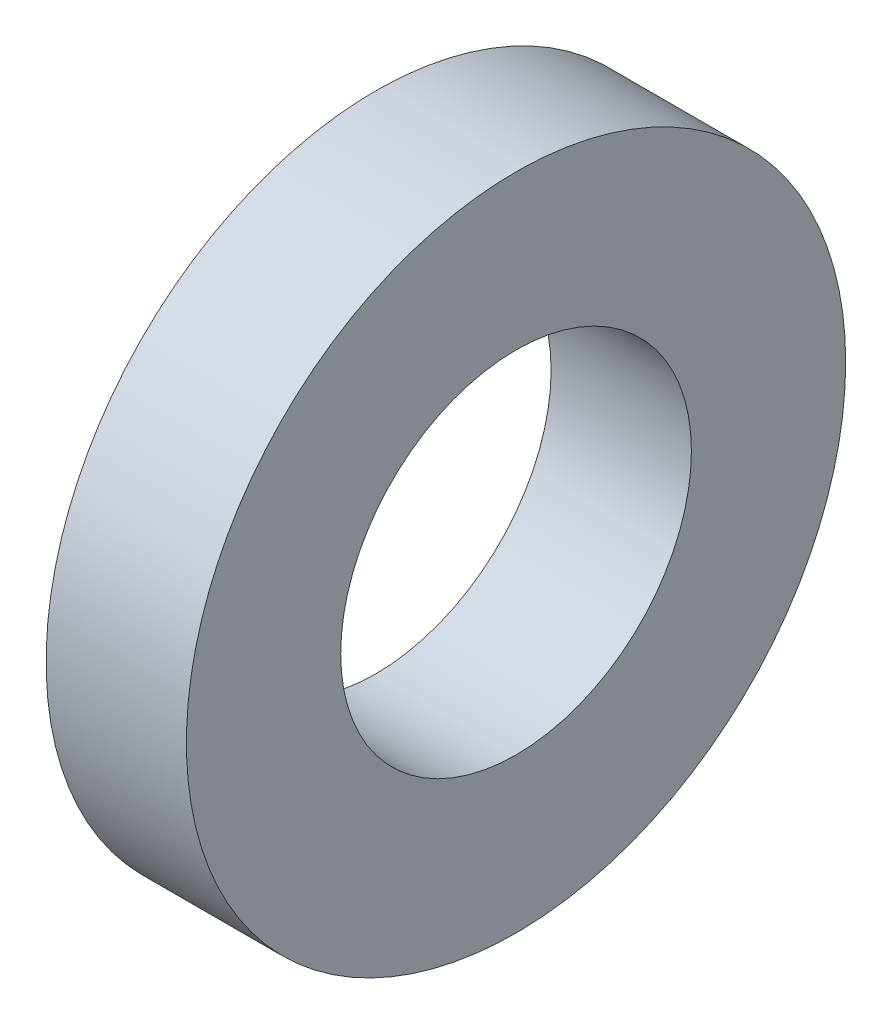
ISO-10303-21;
HEADER;
FILE_DESCRIPTION(('STEP AP214'),'2;1');
FILE_NAME('part.step','',(''),(''),'','','');
FILE_SCHEMA(('AUTOMOTIVE_DESIGN { 1 0 10303 214 1 1 1 1 }'));
ENDSEC;
DATA;
#1=APPLICATION_CONTEXT('core data for automotive mechanical design processes');
#2=APPLICATION_PROTOCOL_DEFINITION('international standard','automotive_design',2000,#1);
#3=PRODUCT_CONTEXT('',#1,'mechanical');
#4=PRODUCT('Part','Part','',(#3));
#5=PRODUCT_RELATED_PRODUCT_CATEGORY('part','',(#4));
#6=PRODUCT_DEFINITION_FORMATION('','',#4);
#7=PRODUCT_DEFINITION_CONTEXT('part definition',#1,'design');
#8=PRODUCT_DEFINITION('design','',#6,#7);
#9=PRODUCT_DEFINITION_SHAPE('','',#8);
#10=(LENGTH_UNIT() NAMED_UNIT(*) SI_UNIT(.MILLI.,.METRE.));
#11=(NAMED_UNIT(*) PLANE_ANGLE_UNIT() SI_UNIT($,.RADIAN.));
#12=(NAMED_UNIT(*) SI_UNIT($,.STERADIAN.) SOLID_ANGLE_UNIT());
#13=UNCERTAINTY_MEASURE_WITH_UNIT(LENGTH_MEASURE(1.E-05),#10,'distance_accuracy_value','');
#14=(GEOMETRIC_REPRESENTATION_CONTEXT(3) GLOBAL_UNCERTAINTY_ASSIGNED_CONTEXT((#13)) GLOBAL_UNIT_ASSIGNED_CONTEXT((#10,
#11,#12)) REPRESENTATION_CONTEXT('',''));
#15=CARTESIAN_POINT('',(0.,0.,0.));
#16=DIRECTION('',(0.,0.,1.));
#17=DIRECTION('',(1.,0.,0.));
#18=AXIS2_PLACEMENT_3D('',#15,#16,#17);
#19=CARTESIAN_POINT('',(10.,0.,0.));
#20=DIRECTION('',(1.,0.,0.));
#21=DIRECTION('',(0.,0.,-1.));
#22=AXIS2_PLACEMENT_3D('',#19,#20,#21);
#23=PLANE('',#22);
#24=CARTESIAN_POINT('',(10.,0.,0.));
#25=DIRECTION('',(1.,0.,0.));
#26=DIRECTION('',(0.,0.,-1.));
#27=AXIS2_PLACEMENT_3D('',#24,#25,#26);
#28=CIRCLE('',#27,23.5);
#29=CARTESIAN_POINT('',(10.,0.,-23.5));
#30=VERTEX_POINT('',#29);
#31=EDGE_CURVE('E10',#30,#30,#28,.T.);
#32=ORIENTED_EDGE('',*,*,#31,.T.);
#33=EDGE_LOOP('',(#32));
#34=FACE_BOUND('',#33,.T.);
#35=CARTESIAN_POINT('',(10.,0.,0.));
#36=DIRECTION('',(1.,0.,0.));
#37=DIRECTION('',(0.,0.,-1.));
#38=AXIS2_PLACEMENT_3D('',#35,#36,#37);
#39=CIRCLE('',#38,12.5);
#40=CARTESIAN_POINT('',(10.,0.,-12.5));
#41=VERTEX_POINT('',#40);
#42=EDGE_CURVE('E56',#41,#41,#39,.T.);
#43=ORIENTED_EDGE('',*,*,#42,.F.);
#44=EDGE_LOOP('',(#43));
#45=FACE_BOUND('',#44,.T.);
#46=ADVANCED_FACE('F43',(#34,#45),#23,.T.);
#47=CARTESIAN_POINT('',(0.,0.,0.));
#48=DIRECTION('',(1.,0.,0.));
#49=DIRECTION('',(0.,0.,-1.));
#50=AXIS2_PLACEMENT_3D('',#47,#48,#49);
#51=PLANE('',#50);
#52=CARTESIAN_POINT('',(0.,0.,0.));
#53=DIRECTION('',(1.,0.,0.));
#54=DIRECTION('',(0.,0.,-1.));
#55=AXIS2_PLACEMENT_3D('',#52,#53,#54);
#56=CIRCLE('',#55,23.5);
#57=CARTESIAN_POINT('',(0.,0.,-23.5));
#58=VERTEX_POINT('',#57);
#59=EDGE_CURVE('E47',#58,#58,#56,.T.);
#60=ORIENTED_EDGE('',*,*,#59,.F.);
#61=EDGE_LOOP('',(#60));
#62=FACE_BOUND('',#61,.T.);
#63=CARTESIAN_POINT('',(0.,0.,0.));
#64=DIRECTION('',(1.,0.,0.));
#65=DIRECTION('',(0.,0.,-1.));
#66=AXIS2_PLACEMENT_3D('',#63,#64,#65);
#67=CIRCLE('',#66,12.5);
#68=CARTESIAN_POINT('',(0.,0.,-12.5));
#69=VERTEX_POINT('',#68);
#70=EDGE_CURVE('E58',#69,#69,#67,.T.);
#71=ORIENTED_EDGE('',*,*,#70,.T.);
#72=EDGE_LOOP('',(#71));
#73=FACE_BOUND('',#72,.T.);
#74=ADVANCED_FACE('F70',(#62,#73),#51,.F.);
#75=CARTESIAN_POINT('',(10.,0.,0.));
#76=DIRECTION('',(-1.,0.,0.));
#77=DIRECTION('',(0.,0.,1.));
#78=AXIS2_PLACEMENT_3D('',#75,#76,#77);
#79=CYLINDRICAL_SURFACE('',#78,23.5);
#80=ORIENTED_EDGE('',*,*,#31,.F.);
#81=EDGE_LOOP('',(#80));
#82=FACE_BOUND('',#81,.T.);
#83=ORIENTED_EDGE('',*,*,#59,.T.);
#84=EDGE_LOOP('',(#83));
#85=FACE_BOUND('',#84,.T.);
#86=ADVANCED_FACE('F45',(#82,#85),#79,.T.);
#87=CARTESIAN_POINT('',(10.,0.,0.));
#88=DIRECTION('',(-1.,0.,0.));
#89=DIRECTION('',(0.,0.,1.));
#90=AXIS2_PLACEMENT_3D('',#87,#88,#89);
#91=CYLINDRICAL_SURFACE('',#90,12.5);
#92=ORIENTED_EDGE('',*,*,#42,.T.);
#93=EDGE_LOOP('',(#92));
#94=FACE_BOUND('',#93,.T.);
#95=ORIENTED_EDGE('',*,*,#70,.F.);
#96=EDGE_LOOP('',(#95));
#97=FACE_BOUND('',#96,.T.);
#98=ADVANCED_FACE('F66',(#94,#97),#91,.F.);
#99=CLOSED_SHELL('',(#46,#74,#86,#98));
#100=MANIFOLD_SOLID_BREP('B2',#99);
#101=ADVANCED_BREP_SHAPE_REPRESENTATION('',(#18,#100),#14);
#102=SHAPE_DEFINITION_REPRESENTATION(#9,#101);
ENDSEC;
END-ISO-10303-21;
